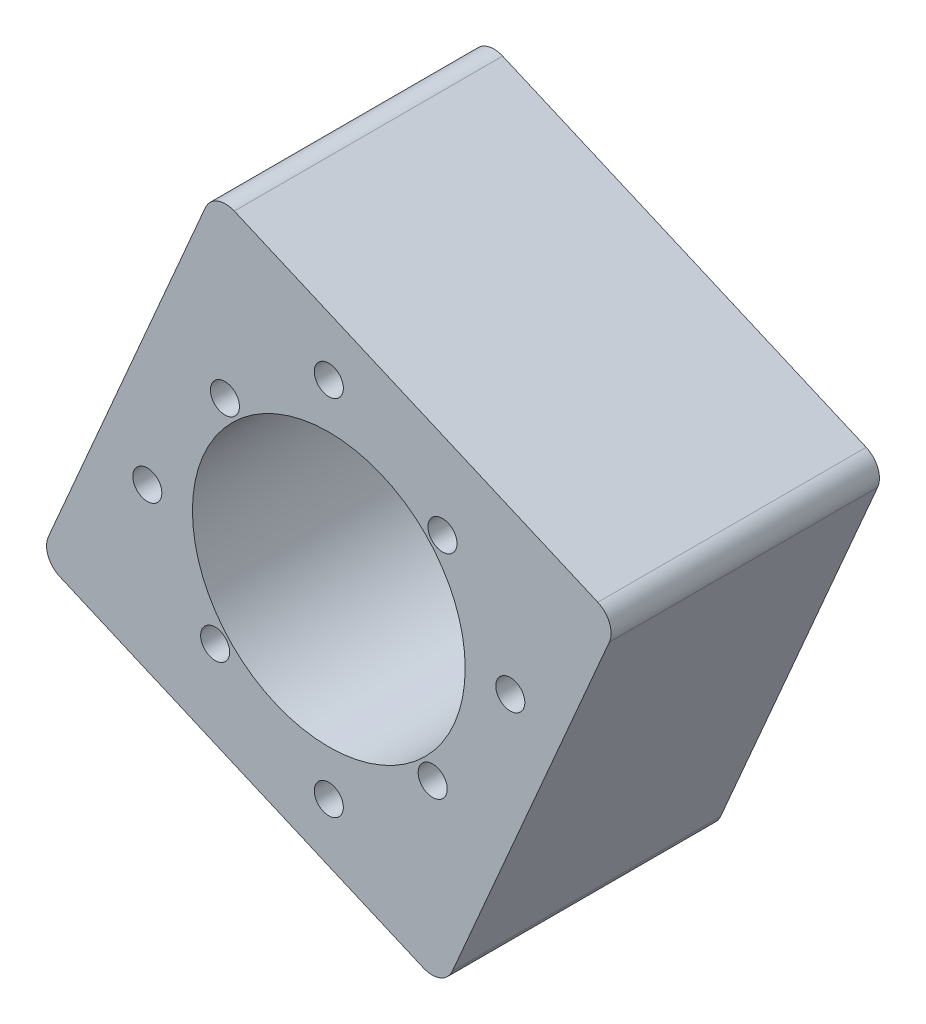
ISO-10303-21;
HEADER;
FILE_DESCRIPTION(('STEP AP214'),'2;1');
FILE_NAME('part.step','',(''),(''),'','','');
FILE_SCHEMA(('AUTOMOTIVE_DESIGN { 1 0 10303 214 1 1 1 1 }'));
ENDSEC;
DATA;
#1=APPLICATION_CONTEXT('core data for automotive mechanical design processes');
#2=APPLICATION_PROTOCOL_DEFINITION('international standard','automotive_design',2000,#1);
#3=PRODUCT_CONTEXT('',#1,'mechanical');
#4=PRODUCT('Part','Part','',(#3));
#5=PRODUCT_RELATED_PRODUCT_CATEGORY('part','',(#4));
#6=PRODUCT_DEFINITION_FORMATION('','',#4);
#7=PRODUCT_DEFINITION_CONTEXT('part definition',#1,'design');
#8=PRODUCT_DEFINITION('design','',#6,#7);
#9=PRODUCT_DEFINITION_SHAPE('','',#8);
#10=(LENGTH_UNIT() NAMED_UNIT(*) SI_UNIT(.MILLI.,.METRE.));
#11=(NAMED_UNIT(*) PLANE_ANGLE_UNIT() SI_UNIT($,.RADIAN.));
#12=(NAMED_UNIT(*) SI_UNIT($,.STERADIAN.) SOLID_ANGLE_UNIT());
#13=UNCERTAINTY_MEASURE_WITH_UNIT(LENGTH_MEASURE(1.E-05),#10,'distance_accuracy_value','');
#14=(GEOMETRIC_REPRESENTATION_CONTEXT(3) GLOBAL_UNCERTAINTY_ASSIGNED_CONTEXT((#13)) GLOBAL_UNIT_ASSIGNED_CONTEXT((#10,
#11,#12)) REPRESENTATION_CONTEXT('',''));
#15=CARTESIAN_POINT('',(0.,0.,0.));
#16=DIRECTION('',(0.,0.,1.));
#17=DIRECTION('',(1.,0.,0.));
#18=AXIS2_PLACEMENT_3D('',#15,#16,#17);
#19=CARTESIAN_POINT('',(0.,0.,7.));
#20=DIRECTION('',(0.,0.,-1.));
#21=DIRECTION('',(-1.,0.,0.));
#22=AXIS2_PLACEMENT_3D('',#19,#20,#21);
#23=CYLINDRICAL_SURFACE('',#22,25.);
#24=CARTESIAN_POINT('',(0.,0.,7.));
#25=DIRECTION('',(0.,0.,-1.));
#26=DIRECTION('',(-1.,0.,0.));
#27=AXIS2_PLACEMENT_3D('',#24,#25,#26);
#28=CIRCLE('',#27,25.);
#29=CARTESIAN_POINT('',(-25.,0.,7.));
#30=VERTEX_POINT('',#29);
#31=EDGE_CURVE('E161',#30,#30,#28,.T.);
#32=ORIENTED_EDGE('',*,*,#31,.F.);
#33=EDGE_LOOP('',(#32));
#34=FACE_BOUND('',#33,.T.);
#35=CARTESIAN_POINT('',(0.,0.,3.));
#36=DIRECTION('',(0.,0.,-1.));
#37=DIRECTION('',(-1.,0.,0.));
#38=AXIS2_PLACEMENT_3D('',#35,#36,#37);
#39=CIRCLE('',#38,25.);
#40=CARTESIAN_POINT('',(-25.,0.,3.));
#41=VERTEX_POINT('',#40);
#42=EDGE_CURVE('E67',#41,#41,#39,.F.);
#43=ORIENTED_EDGE('',*,*,#42,.F.);
#44=EDGE_LOOP('',(#43));
#45=FACE_BOUND('',#44,.T.);
#46=ADVANCED_FACE('F63',(#34,#45),#23,.F.);
#47=CARTESIAN_POINT('',(0.,0.,72.));
#48=DIRECTION('',(0.,0.,-1.));
#49=DIRECTION('',(-1.,0.,0.));
#50=AXIS2_PLACEMENT_3D('',#47,#48,#49);
#51=CYLINDRICAL_SURFACE('',#50,31.);
#52=CARTESIAN_POINT('',(0.,0.,61.));
#53=DIRECTION('',(0.,0.,1.));
#54=DIRECTION('',(1.,0.,0.));
#55=AXIS2_PLACEMENT_3D('',#52,#53,#54);
#56=CIRCLE('',#55,31.);
#57=CARTESIAN_POINT('',(31.,0.,61.));
#58=VERTEX_POINT('',#57);
#59=EDGE_CURVE('E72',#58,#58,#56,.T.);
#60=ORIENTED_EDGE('',*,*,#59,.T.);
#61=EDGE_LOOP('',(#60));
#62=FACE_BOUND('',#61,.T.);
#63=CARTESIAN_POINT('',(0.,0.,7.00000000000001));
#64=DIRECTION('',(0.,0.,-1.));
#65=DIRECTION('',(-1.,0.,0.));
#66=AXIS2_PLACEMENT_3D('',#63,#64,#65);
#67=CIRCLE('',#66,31.);
#68=CARTESIAN_POINT('',(-31.,0.,7.00000000000001));
#69=VERTEX_POINT('',#68);
#70=EDGE_CURVE('E13',#69,#69,#67,.F.);
#71=ORIENTED_EDGE('',*,*,#70,.F.);
#72=EDGE_LOOP('',(#71));
#73=FACE_BOUND('',#72,.T.);
#74=ADVANCED_FACE('F283',(#62,#73),#51,.F.);
#75=CARTESIAN_POINT('',(0.,0.,61.));
#76=DIRECTION('',(0.,0.,1.));
#77=DIRECTION('',(1.,0.,0.));
#78=AXIS2_PLACEMENT_3D('',#75,#76,#77);
#79=PLANE('',#78);
#80=CARTESIAN_POINT('',(-23.6085930044774,25.8386210225883,61.));
#81=DIRECTION('',(0.,0.,1.));
#82=DIRECTION('',(1.,0.,0.));
#83=AXIS2_PLACEMENT_3D('',#80,#81,#82);
#84=CIRCLE('',#83,3.29999999999999);
#85=CARTESIAN_POINT('',(-20.3085930044774,25.8386210225883,61.));
#86=VERTEX_POINT('',#85);
#87=EDGE_CURVE('E199',#86,#86,#84,.T.);
#88=ORIENTED_EDGE('',*,*,#87,.F.);
#89=EDGE_LOOP('',(#88));
#90=FACE_BOUND('',#89,.T.);
#91=CARTESIAN_POINT('',(-25.8386210225883,-23.6085930044774,61.));
#92=DIRECTION('',(0.,0.,1.));
#93=DIRECTION('',(1.,0.,0.));
#94=AXIS2_PLACEMENT_3D('',#91,#92,#93);
#95=CIRCLE('',#94,3.29999999999999);
#96=CARTESIAN_POINT('',(-22.5386210225883,-23.6085930044774,61.));
#97=VERTEX_POINT('',#96);
#98=EDGE_CURVE('E214',#97,#97,#95,.T.);
#99=ORIENTED_EDGE('',*,*,#98,.F.);
#100=EDGE_LOOP('',(#99));
#101=FACE_BOUND('',#100,.T.);
#102=CARTESIAN_POINT('',(23.6085930044774,-25.8386210225883,61.));
#103=DIRECTION('',(0.,0.,1.));
#104=DIRECTION('',(1.,0.,0.));
#105=AXIS2_PLACEMENT_3D('',#102,#103,#104);
#106=CIRCLE('',#105,3.29999999999999);
#107=CARTESIAN_POINT('',(26.9085930044774,-25.8386210225883,61.));
#108=VERTEX_POINT('',#107);
#109=EDGE_CURVE('E220',#108,#108,#106,.T.);
#110=ORIENTED_EDGE('',*,*,#109,.F.);
#111=EDGE_LOOP('',(#110));
#112=FACE_BOUND('',#111,.T.);
#113=CARTESIAN_POINT('',(25.8386210225883,23.6085930044774,61.));
#114=DIRECTION('',(0.,0.,1.));
#115=DIRECTION('',(1.,0.,0.));
#116=AXIS2_PLACEMENT_3D('',#113,#114,#115);
#117=CIRCLE('',#116,3.29999999999999);
#118=CARTESIAN_POINT('',(29.1386210225883,23.6085930044774,61.));
#119=VERTEX_POINT('',#118);
#120=EDGE_CURVE('E226',#119,#119,#117,.T.);
#121=ORIENTED_EDGE('',*,*,#120,.F.);
#122=EDGE_LOOP('',(#121));
#123=FACE_BOUND('',#122,.T.);
#124=CARTESIAN_POINT('',(-41.25,0.,61.));
#125=DIRECTION('',(0.,0.,-1.));
#126=DIRECTION('',(-1.,0.,0.));
#127=AXIS2_PLACEMENT_3D('',#124,#125,#126);
#128=CIRCLE('',#127,3.29999999999998);
#129=CARTESIAN_POINT('',(-44.55,0.,61.));
#130=VERTEX_POINT('',#129);
#131=EDGE_CURVE('E241',#130,#130,#128,.T.);
#132=ORIENTED_EDGE('',*,*,#131,.T.);
#133=EDGE_LOOP('',(#132));
#134=FACE_BOUND('',#133,.T.);
#135=CARTESIAN_POINT('',(0.,41.25,61.));
#136=DIRECTION('',(0.,0.,-1.));
#137=DIRECTION('',(-1.,0.,0.));
#138=AXIS2_PLACEMENT_3D('',#135,#136,#137);
#139=CIRCLE('',#138,3.29999999999998);
#140=CARTESIAN_POINT('',(-3.29999999999998,41.25,61.));
#141=VERTEX_POINT('',#140);
#142=EDGE_CURVE('E253',#141,#141,#139,.T.);
#143=ORIENTED_EDGE('',*,*,#142,.T.);
#144=EDGE_LOOP('',(#143));
#145=FACE_BOUND('',#144,.T.);
#146=CARTESIAN_POINT('',(41.25,0.,61.));
#147=DIRECTION('',(0.,0.,-1.));
#148=DIRECTION('',(-1.,0.,0.));
#149=AXIS2_PLACEMENT_3D('',#146,#147,#148);
#150=CIRCLE('',#149,3.29999999999998);
#151=CARTESIAN_POINT('',(37.95,0.,61.));
#152=VERTEX_POINT('',#151);
#153=EDGE_CURVE('E265',#152,#152,#150,.T.);
#154=ORIENTED_EDGE('',*,*,#153,.T.);
#155=EDGE_LOOP('',(#154));
#156=FACE_BOUND('',#155,.T.);
#157=CARTESIAN_POINT('',(0.,-41.25,61.));
#158=DIRECTION('',(0.,0.,-1.));
#159=DIRECTION('',(-1.,0.,0.));
#160=AXIS2_PLACEMENT_3D('',#157,#158,#159);
#161=CIRCLE('',#160,3.29999999999998);
#162=CARTESIAN_POINT('',(-3.29999999999998,-41.25,61.));
#163=VERTEX_POINT('',#162);
#164=EDGE_CURVE('E277',#163,#163,#161,.T.);
#165=ORIENTED_EDGE('',*,*,#164,.T.);
#166=EDGE_LOOP('',(#165));
#167=FACE_BOUND('',#166,.T.);
#168=ORIENTED_EDGE('',*,*,#59,.F.);
#169=EDGE_LOOP('',(#168));
#170=FACE_BOUND('',#169,.T.);
#171=DIRECTION('',(0.918019699144819,-0.396534780293048,0.));
#172=VECTOR('',#171,1.);
#173=CARTESIAN_POINT('',(19.8267390146524,45.900984957241,61.));
#174=LINE('',#173,#172);
#175=CARTESIAN_POINT('',(-21.4841474468645,63.7450500704281,61.));
#176=VERTEX_POINT('',#175);
#177=CARTESIAN_POINT('',(61.1376254761692,28.0569198440538,61.));
#178=VERTEX_POINT('',#177);
#179=EDGE_CURVE('E202',#176,#178,#174,.T.);
#180=ORIENTED_EDGE('',*,*,#179,.F.);
#181=CARTESIAN_POINT('',(-23.4668213483297,59.154951574704,61.));
#182=DIRECTION('',(0.,0.,1.));
#183=DIRECTION('',(1.,0.,0.));
#184=AXIS2_PLACEMENT_3D('',#181,#182,#183);
#185=CIRCLE('',#184,5.);
#186=CARTESIAN_POINT('',(-28.0569198440538,61.1376254761692,61.));
#187=VERTEX_POINT('',#186);
#188=EDGE_CURVE('E173',#176,#187,#185,.T.);
#189=ORIENTED_EDGE('',*,*,#188,.T.);
#190=DIRECTION('',(-0.396534780293047,-0.918019699144819,0.));
#191=VECTOR('',#190,1.);
#192=CARTESIAN_POINT('',(-45.900984957241,19.8267390146524,61.));
#193=LINE('',#192,#191);
#194=CARTESIAN_POINT('',(-63.7450500704281,-21.4841474468645,61.));
#195=VERTEX_POINT('',#194);
#196=EDGE_CURVE('E183',#187,#195,#193,.T.);
#197=ORIENTED_EDGE('',*,*,#196,.T.);
#198=CARTESIAN_POINT('',(-59.154951574704,-23.4668213483297,61.));
#199=DIRECTION('',(0.,0.,1.));
#200=DIRECTION('',(1.,0.,0.));
#201=AXIS2_PLACEMENT_3D('',#198,#199,#200);
#202=CIRCLE('',#201,5.);
#203=CARTESIAN_POINT('',(-61.1376254761692,-28.0569198440538,61.));
#204=VERTEX_POINT('',#203);
#205=EDGE_CURVE('E142',#204,#195,#202,.F.);
#206=ORIENTED_EDGE('',*,*,#205,.F.);
#207=DIRECTION('',(0.918019699144819,-0.396534780293047,0.));
#208=VECTOR('',#207,1.);
#209=CARTESIAN_POINT('',(-19.8267390146524,-45.900984957241,61.));
#210=LINE('',#209,#208);
#211=CARTESIAN_POINT('',(21.4841474468645,-63.7450500704281,61.));
#212=VERTEX_POINT('',#211);
#213=EDGE_CURVE('E135',#204,#212,#210,.T.);
#214=ORIENTED_EDGE('',*,*,#213,.T.);
#215=CARTESIAN_POINT('',(23.4668213483298,-59.154951574704,61.));
#216=DIRECTION('',(0.,0.,1.));
#217=DIRECTION('',(1.,0.,0.));
#218=AXIS2_PLACEMENT_3D('',#215,#216,#217);
#219=CIRCLE('',#218,5.);
#220=CARTESIAN_POINT('',(28.0569198440539,-61.1376254761692,61.));
#221=VERTEX_POINT('',#220);
#222=EDGE_CURVE('E139',#221,#212,#219,.F.);
#223=ORIENTED_EDGE('',*,*,#222,.F.);
#224=DIRECTION('',(-0.396534780293047,-0.918019699144819,0.));
#225=VECTOR('',#224,1.);
#226=CARTESIAN_POINT('',(45.900984957241,-19.8267390146524,61.));
#227=LINE('',#226,#225);
#228=CARTESIAN_POINT('',(63.7450500704281,21.4841474468645,61.));
#229=VERTEX_POINT('',#228);
#230=EDGE_CURVE('E193',#229,#221,#227,.T.);
#231=ORIENTED_EDGE('',*,*,#230,.F.);
#232=CARTESIAN_POINT('',(59.154951574704,23.4668213483297,61.));
#233=DIRECTION('',(0.,0.,1.));
#234=DIRECTION('',(1.,0.,0.));
#235=AXIS2_PLACEMENT_3D('',#232,#233,#234);
#236=CIRCLE('',#235,5.);
#237=EDGE_CURVE('E188',#229,#178,#236,.T.);
#238=ORIENTED_EDGE('',*,*,#237,.T.);
#239=EDGE_LOOP('',(#180,#189,#197,#206,#214,#223,#231,#238));
#240=FACE_BOUND('',#239,.T.);
#241=ADVANCED_FACE('F137',(#90,#101,#112,#123,#134,#145,#156,#167,#170,#240),#79,.T.);
#242=CARTESIAN_POINT('',(0.,0.,0.));
#243=DIRECTION('',(0.,0.,1.));
#244=DIRECTION('',(1.,0.,0.));
#245=AXIS2_PLACEMENT_3D('',#242,#243,#244);
#246=PLANE('',#245);
#247=CARTESIAN_POINT('',(0.,0.,0.));
#248=DIRECTION('',(0.,0.,-1.));
#249=DIRECTION('',(-1.,0.,0.));
#250=AXIS2_PLACEMENT_3D('',#247,#248,#249);
#251=CIRCLE('',#250,31.);
#252=CARTESIAN_POINT('',(-31.,0.,0.));
#253=VERTEX_POINT('',#252);
#254=EDGE_CURVE('E695',#253,#253,#251,.T.);
#255=ORIENTED_EDGE('',*,*,#254,.F.);
#256=EDGE_LOOP('',(#255));
#257=FACE_BOUND('',#256,.T.);
#258=CARTESIAN_POINT('',(-41.25,0.,0.));
#259=DIRECTION('',(0.,0.,-1.));
#260=DIRECTION('',(-1.,0.,0.));
#261=AXIS2_PLACEMENT_3D('',#258,#259,#260);
#262=CIRCLE('',#261,6.5);
#263=CARTESIAN_POINT('',(-47.75,0.,0.));
#264=VERTEX_POINT('',#263);
#265=EDGE_CURVE('E232',#264,#264,#262,.T.);
#266=ORIENTED_EDGE('',*,*,#265,.F.);
#267=EDGE_LOOP('',(#266));
#268=FACE_BOUND('',#267,.T.);
#269=CARTESIAN_POINT('',(0.,41.25,0.));
#270=DIRECTION('',(0.,0.,-1.));
#271=DIRECTION('',(-1.,0.,0.));
#272=AXIS2_PLACEMENT_3D('',#269,#270,#271);
#273=CIRCLE('',#272,6.5);
#274=CARTESIAN_POINT('',(-6.5,41.25,0.));
#275=VERTEX_POINT('',#274);
#276=EDGE_CURVE('E244',#275,#275,#273,.T.);
#277=ORIENTED_EDGE('',*,*,#276,.F.);
#278=EDGE_LOOP('',(#277));
#279=FACE_BOUND('',#278,.T.);
#280=CARTESIAN_POINT('',(41.25,0.,0.));
#281=DIRECTION('',(0.,0.,-1.));
#282=DIRECTION('',(-1.,0.,0.));
#283=AXIS2_PLACEMENT_3D('',#280,#281,#282);
#284=CIRCLE('',#283,6.5);
#285=CARTESIAN_POINT('',(34.75,0.,0.));
#286=VERTEX_POINT('',#285);
#287=EDGE_CURVE('E256',#286,#286,#284,.T.);
#288=ORIENTED_EDGE('',*,*,#287,.F.);
#289=EDGE_LOOP('',(#288));
#290=FACE_BOUND('',#289,.T.);
#291=CARTESIAN_POINT('',(0.,-41.25,0.));
#292=DIRECTION('',(0.,0.,-1.));
#293=DIRECTION('',(-1.,0.,0.));
#294=AXIS2_PLACEMENT_3D('',#291,#292,#293);
#295=CIRCLE('',#294,6.5);
#296=CARTESIAN_POINT('',(-6.5,-41.25,0.));
#297=VERTEX_POINT('',#296);
#298=EDGE_CURVE('E268',#297,#297,#295,.T.);
#299=ORIENTED_EDGE('',*,*,#298,.F.);
#300=EDGE_LOOP('',(#299));
#301=FACE_BOUND('',#300,.T.);
#302=DIRECTION('',(-0.396534780293047,-0.91801969914482,0.));
#303=VECTOR('',#302,1.);
#304=CARTESIAN_POINT('',(45.900984957241,-19.8267390146524,0.));
#305=LINE('',#304,#303);
#306=CARTESIAN_POINT('',(63.7450500704281,21.4841474468645,0.));
#307=VERTEX_POINT('',#306);
#308=CARTESIAN_POINT('',(28.0569198440539,-61.1376254761692,0.));
#309=VERTEX_POINT('',#308);
#310=EDGE_CURVE('E194',#307,#309,#305,.T.);
#311=ORIENTED_EDGE('',*,*,#310,.T.);
#312=CARTESIAN_POINT('',(23.4668213483298,-59.154951574704,0.));
#313=DIRECTION('',(0.,0.,-1.));
#314=DIRECTION('',(-1.,0.,0.));
#315=AXIS2_PLACEMENT_3D('',#312,#313,#314);
#316=CIRCLE('',#315,5.);
#317=CARTESIAN_POINT('',(21.4841474468645,-63.7450500704281,0.));
#318=VERTEX_POINT('',#317);
#319=EDGE_CURVE('E159',#309,#318,#316,.T.);
#320=ORIENTED_EDGE('',*,*,#319,.T.);
#321=DIRECTION('',(0.91801969914482,-0.396534780293047,0.));
#322=VECTOR('',#321,1.);
#323=CARTESIAN_POINT('',(-19.8267390146524,-45.900984957241,0.));
#324=LINE('',#323,#322);
#325=CARTESIAN_POINT('',(-61.1376254761692,-28.0569198440539,0.));
#326=VERTEX_POINT('',#325);
#327=EDGE_CURVE('E152',#326,#318,#324,.T.);
#328=ORIENTED_EDGE('',*,*,#327,.F.);
#329=CARTESIAN_POINT('',(-59.154951574704,-23.4668213483297,0.));
#330=DIRECTION('',(0.,0.,-1.));
#331=DIRECTION('',(-1.,0.,0.));
#332=AXIS2_PLACEMENT_3D('',#329,#330,#331);
#333=CIRCLE('',#332,5.);
#334=CARTESIAN_POINT('',(-63.7450500704281,-21.4841474468645,0.));
#335=VERTEX_POINT('',#334);
#336=EDGE_CURVE('E145',#326,#335,#333,.T.);
#337=ORIENTED_EDGE('',*,*,#336,.T.);
#338=DIRECTION('',(-0.396534780293047,-0.91801969914482,0.));
#339=VECTOR('',#338,1.);
#340=CARTESIAN_POINT('',(-45.900984957241,19.8267390146524,0.));
#341=LINE('',#340,#339);
#342=CARTESIAN_POINT('',(-28.0569198440538,61.1376254761692,0.));
#343=VERTEX_POINT('',#342);
#344=EDGE_CURVE('E180',#343,#335,#341,.T.);
#345=ORIENTED_EDGE('',*,*,#344,.F.);
#346=CARTESIAN_POINT('',(-23.4668213483297,59.154951574704,0.));
#347=DIRECTION('',(0.,0.,-1.));
#348=DIRECTION('',(-1.,0.,0.));
#349=AXIS2_PLACEMENT_3D('',#346,#347,#348);
#350=CIRCLE('',#349,5.);
#351=CARTESIAN_POINT('',(-21.4841474468645,63.7450500704281,0.));
#352=VERTEX_POINT('',#351);
#353=EDGE_CURVE('E179',#352,#343,#350,.F.);
#354=ORIENTED_EDGE('',*,*,#353,.F.);
#355=DIRECTION('',(0.91801969914482,-0.396534780293048,0.));
#356=VECTOR('',#355,1.);
#357=CARTESIAN_POINT('',(19.8267390146524,45.900984957241,0.));
#358=LINE('',#357,#356);
#359=CARTESIAN_POINT('',(61.1376254761692,28.0569198440538,0.));
#360=VERTEX_POINT('',#359);
#361=EDGE_CURVE('E190',#352,#360,#358,.T.);
#362=ORIENTED_EDGE('',*,*,#361,.T.);
#363=CARTESIAN_POINT('',(59.154951574704,23.4668213483297,0.));
#364=DIRECTION('',(0.,0.,-1.));
#365=DIRECTION('',(-1.,0.,0.));
#366=AXIS2_PLACEMENT_3D('',#363,#364,#365);
#367=CIRCLE('',#366,5.);
#368=EDGE_CURVE('E196',#307,#360,#367,.F.);
#369=ORIENTED_EDGE('',*,*,#368,.F.);
#370=EDGE_LOOP('',(#311,#320,#328,#337,#345,#354,#362,#369));
#371=FACE_BOUND('',#370,.T.);
#372=ADVANCED_FACE('F65',(#257,#268,#279,#290,#301,#371),#246,.F.);
#373=CARTESIAN_POINT('',(0.,-41.25,0.));
#374=DIRECTION('',(0.,0.,-1.));
#375=DIRECTION('',(-1.,0.,0.));
#376=AXIS2_PLACEMENT_3D('',#373,#374,#375);
#377=CYLINDRICAL_SURFACE('',#376,3.29999999999999);
#378=ORIENTED_EDGE('',*,*,#164,.F.);
#379=EDGE_LOOP('',(#378));
#380=FACE_BOUND('',#379,.T.);
#381=CARTESIAN_POINT('',(0.,-41.25,4.6));
#382=DIRECTION('',(0.,0.,-1.));
#383=DIRECTION('',(-1.,0.,0.));
#384=AXIS2_PLACEMENT_3D('',#381,#382,#383);
#385=CIRCLE('',#384,3.3);
#386=CARTESIAN_POINT('',(-3.3,-41.25,4.6));
#387=VERTEX_POINT('',#386);
#388=EDGE_CURVE('E274',#387,#387,#385,.T.);
#389=ORIENTED_EDGE('',*,*,#388,.T.);
#390=EDGE_LOOP('',(#389));
#391=FACE_BOUND('',#390,.T.);
#392=ADVANCED_FACE('F292',(#380,#391),#377,.F.);
#393=CARTESIAN_POINT('',(3.3,-41.25,4.6));
#394=DIRECTION('',(0.,0.,1.));
#395=DIRECTION('',(1.,0.,0.));
#396=AXIS2_PLACEMENT_3D('',#393,#394,#395);
#397=PLANE('',#396);
#398=ORIENTED_EDGE('',*,*,#388,.F.);
#399=EDGE_LOOP('',(#398));
#400=FACE_BOUND('',#399,.T.);
#401=CARTESIAN_POINT('',(0.,-41.25,4.6));
#402=DIRECTION('',(0.,0.,-1.));
#403=DIRECTION('',(-1.,0.,0.));
#404=AXIS2_PLACEMENT_3D('',#401,#402,#403);
#405=CIRCLE('',#404,6.5);
#406=CARTESIAN_POINT('',(-6.5,-41.25,4.6));
#407=VERTEX_POINT('',#406);
#408=EDGE_CURVE('E271',#407,#407,#405,.T.);
#409=ORIENTED_EDGE('',*,*,#408,.T.);
#410=EDGE_LOOP('',(#409));
#411=FACE_BOUND('',#410,.T.);
#412=ADVANCED_FACE('F410',(#400,#411),#397,.F.);
#413=CARTESIAN_POINT('',(0.,-41.25,0.));
#414=DIRECTION('',(0.,0.,-1.));
#415=DIRECTION('',(-1.,0.,0.));
#416=AXIS2_PLACEMENT_3D('',#413,#414,#415);
#417=CYLINDRICAL_SURFACE('',#416,6.5);
#418=ORIENTED_EDGE('',*,*,#408,.F.);
#419=EDGE_LOOP('',(#418));
#420=FACE_BOUND('',#419,.T.);
#421=ORIENTED_EDGE('',*,*,#298,.T.);
#422=EDGE_LOOP('',(#421));
#423=FACE_BOUND('',#422,.T.);
#424=ADVANCED_FACE('F406',(#420,#423),#417,.F.);
#425=CARTESIAN_POINT('',(41.25,0.,0.));
#426=DIRECTION('',(0.,0.,-1.));
#427=DIRECTION('',(-1.,0.,0.));
#428=AXIS2_PLACEMENT_3D('',#425,#426,#427);
#429=CYLINDRICAL_SURFACE('',#428,3.29999999999999);
#430=ORIENTED_EDGE('',*,*,#153,.F.);
#431=EDGE_LOOP('',(#430));
#432=FACE_BOUND('',#431,.T.);
#433=CARTESIAN_POINT('',(41.25,0.,4.6));
#434=DIRECTION('',(0.,0.,-1.));
#435=DIRECTION('',(-1.,0.,0.));
#436=AXIS2_PLACEMENT_3D('',#433,#434,#435);
#437=CIRCLE('',#436,3.3);
#438=CARTESIAN_POINT('',(37.95,0.,4.6));
#439=VERTEX_POINT('',#438);
#440=EDGE_CURVE('E262',#439,#439,#437,.T.);
#441=ORIENTED_EDGE('',*,*,#440,.T.);
#442=EDGE_LOOP('',(#441));
#443=FACE_BOUND('',#442,.T.);
#444=ADVANCED_FACE('F402',(#432,#443),#429,.F.);
#445=CARTESIAN_POINT('',(44.55,0.,4.6));
#446=DIRECTION('',(0.,0.,1.));
#447=DIRECTION('',(1.,0.,0.));
#448=AXIS2_PLACEMENT_3D('',#445,#446,#447);
#449=PLANE('',#448);
#450=ORIENTED_EDGE('',*,*,#440,.F.);
#451=EDGE_LOOP('',(#450));
#452=FACE_BOUND('',#451,.T.);
#453=CARTESIAN_POINT('',(41.25,0.,4.6));
#454=DIRECTION('',(0.,0.,-1.));
#455=DIRECTION('',(-1.,0.,0.));
#456=AXIS2_PLACEMENT_3D('',#453,#454,#455);
#457=CIRCLE('',#456,6.5);
#458=CARTESIAN_POINT('',(34.75,0.,4.6));
#459=VERTEX_POINT('',#458);
#460=EDGE_CURVE('E259',#459,#459,#457,.T.);
#461=ORIENTED_EDGE('',*,*,#460,.T.);
#462=EDGE_LOOP('',(#461));
#463=FACE_BOUND('',#462,.T.);
#464=ADVANCED_FACE('F398',(#452,#463),#449,.F.);
#465=CARTESIAN_POINT('',(41.25,0.,0.));
#466=DIRECTION('',(0.,0.,-1.));
#467=DIRECTION('',(-1.,0.,0.));
#468=AXIS2_PLACEMENT_3D('',#465,#466,#467);
#469=CYLINDRICAL_SURFACE('',#468,6.5);
#470=ORIENTED_EDGE('',*,*,#460,.F.);
#471=EDGE_LOOP('',(#470));
#472=FACE_BOUND('',#471,.T.);
#473=ORIENTED_EDGE('',*,*,#287,.T.);
#474=EDGE_LOOP('',(#473));
#475=FACE_BOUND('',#474,.T.);
#476=ADVANCED_FACE('F394',(#472,#475),#469,.F.);
#477=CARTESIAN_POINT('',(0.,41.25,0.));
#478=DIRECTION('',(0.,0.,-1.));
#479=DIRECTION('',(-1.,0.,0.));
#480=AXIS2_PLACEMENT_3D('',#477,#478,#479);
#481=CYLINDRICAL_SURFACE('',#480,3.29999999999999);
#482=ORIENTED_EDGE('',*,*,#142,.F.);
#483=EDGE_LOOP('',(#482));
#484=FACE_BOUND('',#483,.T.);
#485=CARTESIAN_POINT('',(0.,41.25,4.6));
#486=DIRECTION('',(0.,0.,-1.));
#487=DIRECTION('',(-1.,0.,0.));
#488=AXIS2_PLACEMENT_3D('',#485,#486,#487);
#489=CIRCLE('',#488,3.3);
#490=CARTESIAN_POINT('',(-3.3,41.25,4.6));
#491=VERTEX_POINT('',#490);
#492=EDGE_CURVE('E250',#491,#491,#489,.T.);
#493=ORIENTED_EDGE('',*,*,#492,.T.);
#494=EDGE_LOOP('',(#493));
#495=FACE_BOUND('',#494,.T.);
#496=ADVANCED_FACE('F390',(#484,#495),#481,.F.);
#497=CARTESIAN_POINT('',(3.3,41.25,4.6));
#498=DIRECTION('',(0.,0.,1.));
#499=DIRECTION('',(1.,0.,0.));
#500=AXIS2_PLACEMENT_3D('',#497,#498,#499);
#501=PLANE('',#500);
#502=ORIENTED_EDGE('',*,*,#492,.F.);
#503=EDGE_LOOP('',(#502));
#504=FACE_BOUND('',#503,.T.);
#505=CARTESIAN_POINT('',(0.,41.25,4.6));
#506=DIRECTION('',(0.,0.,-1.));
#507=DIRECTION('',(-1.,0.,0.));
#508=AXIS2_PLACEMENT_3D('',#505,#506,#507);
#509=CIRCLE('',#508,6.5);
#510=CARTESIAN_POINT('',(-6.5,41.25,4.6));
#511=VERTEX_POINT('',#510);
#512=EDGE_CURVE('E247',#511,#511,#509,.T.);
#513=ORIENTED_EDGE('',*,*,#512,.T.);
#514=EDGE_LOOP('',(#513));
#515=FACE_BOUND('',#514,.T.);
#516=ADVANCED_FACE('F386',(#504,#515),#501,.F.);
#517=CARTESIAN_POINT('',(0.,41.25,0.));
#518=DIRECTION('',(0.,0.,-1.));
#519=DIRECTION('',(-1.,0.,0.));
#520=AXIS2_PLACEMENT_3D('',#517,#518,#519);
#521=CYLINDRICAL_SURFACE('',#520,6.5);
#522=ORIENTED_EDGE('',*,*,#512,.F.);
#523=EDGE_LOOP('',(#522));
#524=FACE_BOUND('',#523,.T.);
#525=ORIENTED_EDGE('',*,*,#276,.T.);
#526=EDGE_LOOP('',(#525));
#527=FACE_BOUND('',#526,.T.);
#528=ADVANCED_FACE('F382',(#524,#527),#521,.F.);
#529=CARTESIAN_POINT('',(-41.25,0.,0.));
#530=DIRECTION('',(0.,0.,-1.));
#531=DIRECTION('',(-1.,0.,0.));
#532=AXIS2_PLACEMENT_3D('',#529,#530,#531);
#533=CYLINDRICAL_SURFACE('',#532,3.29999999999999);
#534=ORIENTED_EDGE('',*,*,#131,.F.);
#535=EDGE_LOOP('',(#534));
#536=FACE_BOUND('',#535,.T.);
#537=CARTESIAN_POINT('',(-41.25,0.,4.6));
#538=DIRECTION('',(0.,0.,-1.));
#539=DIRECTION('',(-1.,0.,0.));
#540=AXIS2_PLACEMENT_3D('',#537,#538,#539);
#541=CIRCLE('',#540,3.3);
#542=CARTESIAN_POINT('',(-44.55,0.,4.6));
#543=VERTEX_POINT('',#542);
#544=EDGE_CURVE('E238',#543,#543,#541,.T.);
#545=ORIENTED_EDGE('',*,*,#544,.T.);
#546=EDGE_LOOP('',(#545));
#547=FACE_BOUND('',#546,.T.);
#548=ADVANCED_FACE('F378',(#536,#547),#533,.F.);
#549=CARTESIAN_POINT('',(-37.95,0.,4.6));
#550=DIRECTION('',(0.,0.,1.));
#551=DIRECTION('',(1.,0.,0.));
#552=AXIS2_PLACEMENT_3D('',#549,#550,#551);
#553=PLANE('',#552);
#554=ORIENTED_EDGE('',*,*,#544,.F.);
#555=EDGE_LOOP('',(#554));
#556=FACE_BOUND('',#555,.T.);
#557=CARTESIAN_POINT('',(-41.25,0.,4.6));
#558=DIRECTION('',(0.,0.,-1.));
#559=DIRECTION('',(-1.,0.,0.));
#560=AXIS2_PLACEMENT_3D('',#557,#558,#559);
#561=CIRCLE('',#560,6.5);
#562=CARTESIAN_POINT('',(-47.75,0.,4.6));
#563=VERTEX_POINT('',#562);
#564=EDGE_CURVE('E235',#563,#563,#561,.T.);
#565=ORIENTED_EDGE('',*,*,#564,.T.);
#566=EDGE_LOOP('',(#565));
#567=FACE_BOUND('',#566,.T.);
#568=ADVANCED_FACE('F374',(#556,#567),#553,.F.);
#569=CARTESIAN_POINT('',(-41.25,0.,0.));
#570=DIRECTION('',(0.,0.,-1.));
#571=DIRECTION('',(-1.,0.,0.));
#572=AXIS2_PLACEMENT_3D('',#569,#570,#571);
#573=CYLINDRICAL_SURFACE('',#572,6.5);
#574=ORIENTED_EDGE('',*,*,#564,.F.);
#575=EDGE_LOOP('',(#574));
#576=FACE_BOUND('',#575,.T.);
#577=ORIENTED_EDGE('',*,*,#265,.T.);
#578=EDGE_LOOP('',(#577));
#579=FACE_BOUND('',#578,.T.);
#580=ADVANCED_FACE('F371',(#576,#579),#573,.F.);
#581=CARTESIAN_POINT('',(25.8386210225883,23.6085930044774,56.));
#582=DIRECTION('',(0.,0.,1.));
#583=DIRECTION('',(1.,0.,0.));
#584=AXIS2_PLACEMENT_3D('',#581,#582,#583);
#585=CONICAL_SURFACE('',#584,3.29999999999999,1.0471975511966);
#586=CARTESIAN_POINT('',(25.8386210225883,23.6085930044774,54.0947441116742));
#587=VERTEX_POINT('',#586);
#588=VERTEX_LOOP('',#587);
#589=FACE_BOUND('',#588,.T.);
#590=CARTESIAN_POINT('',(25.8386210225883,23.6085930044774,56.));
#591=DIRECTION('',(0.,0.,1.));
#592=DIRECTION('',(1.,0.,0.));
#593=AXIS2_PLACEMENT_3D('',#590,#591,#592);
#594=CIRCLE('',#593,3.29999999999999);
#595=CARTESIAN_POINT('',(29.1386210225883,23.6085930044774,56.));
#596=VERTEX_POINT('',#595);
#597=EDGE_CURVE('E229',#596,#596,#594,.T.);
#598=ORIENTED_EDGE('',*,*,#597,.T.);
#599=EDGE_LOOP('',(#598));
#600=FACE_BOUND('',#599,.T.);
#601=ADVANCED_FACE('F367',(#589,#600),#585,.F.);
#602=CARTESIAN_POINT('',(25.8386210225883,23.6085930044774,61.));
#603=DIRECTION('',(0.,0.,1.));
#604=DIRECTION('',(1.,0.,0.));
#605=AXIS2_PLACEMENT_3D('',#602,#603,#604);
#606=CYLINDRICAL_SURFACE('',#605,3.29999999999999);
#607=ORIENTED_EDGE('',*,*,#597,.F.);
#608=EDGE_LOOP('',(#607));
#609=FACE_BOUND('',#608,.T.);
#610=ORIENTED_EDGE('',*,*,#120,.T.);
#611=EDGE_LOOP('',(#610));
#612=FACE_BOUND('',#611,.T.);
#613=ADVANCED_FACE('F364',(#609,#612),#606,.F.);
#614=CARTESIAN_POINT('',(23.6085930044774,-25.8386210225883,56.));
#615=DIRECTION('',(0.,0.,1.));
#616=DIRECTION('',(1.,0.,0.));
#617=AXIS2_PLACEMENT_3D('',#614,#615,#616);
#618=CONICAL_SURFACE('',#617,3.29999999999999,1.0471975511966);
#619=CARTESIAN_POINT('',(23.6085930044774,-25.8386210225883,54.0947441116742));
#620=VERTEX_POINT('',#619);
#621=VERTEX_LOOP('',#620);
#622=FACE_BOUND('',#621,.T.);
#623=CARTESIAN_POINT('',(23.6085930044774,-25.8386210225883,56.));
#624=DIRECTION('',(0.,0.,1.));
#625=DIRECTION('',(1.,0.,0.));
#626=AXIS2_PLACEMENT_3D('',#623,#624,#625);
#627=CIRCLE('',#626,3.29999999999999);
#628=CARTESIAN_POINT('',(26.9085930044774,-25.8386210225883,56.));
#629=VERTEX_POINT('',#628);
#630=EDGE_CURVE('E223',#629,#629,#627,.T.);
#631=ORIENTED_EDGE('',*,*,#630,.T.);
#632=EDGE_LOOP('',(#631));
#633=FACE_BOUND('',#632,.T.);
#634=ADVANCED_FACE('F360',(#622,#633),#618,.F.);
#635=CARTESIAN_POINT('',(23.6085930044774,-25.8386210225883,61.));
#636=DIRECTION('',(0.,0.,1.));
#637=DIRECTION('',(1.,0.,0.));
#638=AXIS2_PLACEMENT_3D('',#635,#636,#637);
#639=CYLINDRICAL_SURFACE('',#638,3.29999999999999);
#640=ORIENTED_EDGE('',*,*,#630,.F.);
#641=EDGE_LOOP('',(#640));
#642=FACE_BOUND('',#641,.T.);
#643=ORIENTED_EDGE('',*,*,#109,.T.);
#644=EDGE_LOOP('',(#643));
#645=FACE_BOUND('',#644,.T.);
#646=ADVANCED_FACE('F356',(#642,#645),#639,.F.);
#647=CARTESIAN_POINT('',(-25.8386210225883,-23.6085930044774,56.));
#648=DIRECTION('',(0.,0.,1.));
#649=DIRECTION('',(1.,0.,0.));
#650=AXIS2_PLACEMENT_3D('',#647,#648,#649);
#651=CONICAL_SURFACE('',#650,3.29999999999999,1.0471975511966);
#652=CARTESIAN_POINT('',(-25.8386210225883,-23.6085930044774,54.0947441116742));
#653=VERTEX_POINT('',#652);
#654=VERTEX_LOOP('',#653);
#655=FACE_BOUND('',#654,.T.);
#656=CARTESIAN_POINT('',(-25.8386210225883,-23.6085930044774,56.));
#657=DIRECTION('',(0.,0.,1.));
#658=DIRECTION('',(1.,0.,0.));
#659=AXIS2_PLACEMENT_3D('',#656,#657,#658);
#660=CIRCLE('',#659,3.29999999999999);
#661=CARTESIAN_POINT('',(-22.5386210225883,-23.6085930044774,56.));
#662=VERTEX_POINT('',#661);
#663=EDGE_CURVE('E217',#662,#662,#660,.T.);
#664=ORIENTED_EDGE('',*,*,#663,.T.);
#665=EDGE_LOOP('',(#664));
#666=FACE_BOUND('',#665,.T.);
#667=ADVANCED_FACE('F352',(#655,#666),#651,.F.);
#668=CARTESIAN_POINT('',(-25.8386210225883,-23.6085930044774,61.));
#669=DIRECTION('',(0.,0.,1.));
#670=DIRECTION('',(1.,0.,0.));
#671=AXIS2_PLACEMENT_3D('',#668,#669,#670);
#672=CYLINDRICAL_SURFACE('',#671,3.29999999999999);
#673=ORIENTED_EDGE('',*,*,#663,.F.);
#674=EDGE_LOOP('',(#673));
#675=FACE_BOUND('',#674,.T.);
#676=ORIENTED_EDGE('',*,*,#98,.T.);
#677=EDGE_LOOP('',(#676));
#678=FACE_BOUND('',#677,.T.);
#679=ADVANCED_FACE('F348',(#675,#678),#672,.F.);
#680=CARTESIAN_POINT('',(-23.6085930044774,25.8386210225883,56.));
#681=DIRECTION('',(0.,0.,1.));
#682=DIRECTION('',(1.,0.,0.));
#683=AXIS2_PLACEMENT_3D('',#680,#681,#682);
#684=CONICAL_SURFACE('',#683,3.29999999999999,1.0471975511966);
#685=CARTESIAN_POINT('',(-23.6085930044774,25.8386210225883,54.0947441116742));
#686=VERTEX_POINT('',#685);
#687=VERTEX_LOOP('',#686);
#688=FACE_BOUND('',#687,.T.);
#689=CARTESIAN_POINT('',(-23.6085930044774,25.8386210225883,56.));
#690=DIRECTION('',(0.,0.,1.));
#691=DIRECTION('',(1.,0.,0.));
#692=AXIS2_PLACEMENT_3D('',#689,#690,#691);
#693=CIRCLE('',#692,3.29999999999999);
#694=CARTESIAN_POINT('',(-20.3085930044774,25.8386210225883,56.));
#695=VERTEX_POINT('',#694);
#696=EDGE_CURVE('E211',#695,#695,#693,.T.);
#697=ORIENTED_EDGE('',*,*,#696,.T.);
#698=EDGE_LOOP('',(#697));
#699=FACE_BOUND('',#698,.T.);
#700=ADVANCED_FACE('F344',(#688,#699),#684,.F.);
#701=CARTESIAN_POINT('',(-23.6085930044774,25.8386210225883,61.));
#702=DIRECTION('',(0.,0.,1.));
#703=DIRECTION('',(1.,0.,0.));
#704=AXIS2_PLACEMENT_3D('',#701,#702,#703);
#705=CYLINDRICAL_SURFACE('',#704,3.29999999999999);
#706=ORIENTED_EDGE('',*,*,#696,.F.);
#707=EDGE_LOOP('',(#706));
#708=FACE_BOUND('',#707,.T.);
#709=ORIENTED_EDGE('',*,*,#87,.T.);
#710=EDGE_LOOP('',(#709));
#711=FACE_BOUND('',#710,.T.);
#712=ADVANCED_FACE('F340',(#708,#711),#705,.F.);
#713=CARTESIAN_POINT('',(45.900984957241,-19.8267390146524,201.27877475904));
#714=DIRECTION('',(0.918019699144819,-0.396534780293047,0.));
#715=DIRECTION('',(0.396534780293047,0.918019699144819,0.));
#716=AXIS2_PLACEMENT_3D('',#713,#714,#715);
#717=PLANE('',#716);
#718=DIRECTION('',(0.,0.,-1.));
#719=VECTOR('',#718,1.);
#720=CARTESIAN_POINT('',(63.7450500704281,21.4841474468645,201.27877475904));
#721=LINE('',#720,#719);
#722=EDGE_CURVE('E200',#229,#307,#721,.T.);
#723=ORIENTED_EDGE('',*,*,#722,.F.);
#724=ORIENTED_EDGE('',*,*,#230,.T.);
#725=DIRECTION('',(0.,0.,-1.));
#726=VECTOR('',#725,1.);
#727=CARTESIAN_POINT('',(28.0569198440539,-61.1376254761692,201.27877475904));
#728=LINE('',#727,#726);
#729=EDGE_CURVE('E146',#221,#309,#728,.T.);
#730=ORIENTED_EDGE('',*,*,#729,.T.);
#731=ORIENTED_EDGE('',*,*,#310,.F.);
#732=EDGE_LOOP('',(#723,#724,#730,#731));
#733=FACE_BOUND('',#732,.T.);
#734=ADVANCED_FACE('F336',(#733),#717,.T.);
#735=CARTESIAN_POINT('',(19.8267390146524,45.900984957241,201.27877475904));
#736=DIRECTION('',(0.396534780293047,0.918019699144819,0.));
#737=DIRECTION('',(-0.918019699144819,0.396534780293048,0.));
#738=AXIS2_PLACEMENT_3D('',#735,#736,#737);
#739=PLANE('',#738);
#740=ORIENTED_EDGE('',*,*,#361,.F.);
#741=DIRECTION('',(0.,0.,-1.));
#742=VECTOR('',#741,1.);
#743=CARTESIAN_POINT('',(-21.4841474468645,63.7450500704281,201.27877475904));
#744=LINE('',#743,#742);
#745=EDGE_CURVE('E176',#176,#352,#744,.T.);
#746=ORIENTED_EDGE('',*,*,#745,.F.);
#747=ORIENTED_EDGE('',*,*,#179,.T.);
#748=DIRECTION('',(0.,0.,-1.));
#749=VECTOR('',#748,1.);
#750=CARTESIAN_POINT('',(61.1376254761692,28.0569198440538,201.27877475904));
#751=LINE('',#750,#749);
#752=EDGE_CURVE('E206',#178,#360,#751,.T.);
#753=ORIENTED_EDGE('',*,*,#752,.T.);
#754=EDGE_LOOP('',(#740,#746,#747,#753));
#755=FACE_BOUND('',#754,.T.);
#756=ADVANCED_FACE('F332',(#755),#739,.T.);
#757=CARTESIAN_POINT('',(59.154951574704,23.4668213483297,201.27877475904));
#758=DIRECTION('',(0.,0.,-1.));
#759=DIRECTION('',(-1.,0.,0.));
#760=AXIS2_PLACEMENT_3D('',#757,#758,#759);
#761=CYLINDRICAL_SURFACE('',#760,5.);
#762=ORIENTED_EDGE('',*,*,#237,.F.);
#763=ORIENTED_EDGE('',*,*,#722,.T.);
#764=ORIENTED_EDGE('',*,*,#368,.T.);
#765=ORIENTED_EDGE('',*,*,#752,.F.);
#766=EDGE_LOOP('',(#762,#763,#764,#765));
#767=FACE_BOUND('',#766,.T.);
#768=ADVANCED_FACE('F325',(#767),#761,.T.);
#769=CARTESIAN_POINT('',(-45.900984957241,19.8267390146524,201.27877475904));
#770=DIRECTION('',(0.918019699144819,-0.396534780293047,0.));
#771=DIRECTION('',(0.396534780293047,0.918019699144819,0.));
#772=AXIS2_PLACEMENT_3D('',#769,#770,#771);
#773=PLANE('',#772);
#774=ORIENTED_EDGE('',*,*,#196,.F.);
#775=DIRECTION('',(0.,0.,-1.));
#776=VECTOR('',#775,1.);
#777=CARTESIAN_POINT('',(-28.0569198440538,61.1376254761692,201.27877475904));
#778=LINE('',#777,#776);
#779=EDGE_CURVE('E181',#187,#343,#778,.T.);
#780=ORIENTED_EDGE('',*,*,#779,.T.);
#781=ORIENTED_EDGE('',*,*,#344,.T.);
#782=DIRECTION('',(0.,0.,-1.));
#783=VECTOR('',#782,1.);
#784=CARTESIAN_POINT('',(-63.7450500704281,-21.4841474468645,201.27877475904));
#785=LINE('',#784,#783);
#786=EDGE_CURVE('E168',#195,#335,#785,.T.);
#787=ORIENTED_EDGE('',*,*,#786,.F.);
#788=EDGE_LOOP('',(#774,#780,#781,#787));
#789=FACE_BOUND('',#788,.T.);
#790=ADVANCED_FACE('F322',(#789),#773,.F.);
#791=CARTESIAN_POINT('',(-23.4668213483297,59.154951574704,201.27877475904));
#792=DIRECTION('',(0.,0.,-1.));
#793=DIRECTION('',(-1.,0.,0.));
#794=AXIS2_PLACEMENT_3D('',#791,#792,#793);
#795=CYLINDRICAL_SURFACE('',#794,5.);
#796=ORIENTED_EDGE('',*,*,#188,.F.);
#797=ORIENTED_EDGE('',*,*,#745,.T.);
#798=ORIENTED_EDGE('',*,*,#353,.T.);
#799=ORIENTED_EDGE('',*,*,#779,.F.);
#800=EDGE_LOOP('',(#796,#797,#798,#799));
#801=FACE_BOUND('',#800,.T.);
#802=ADVANCED_FACE('F318',(#801),#795,.T.);
#803=CARTESIAN_POINT('',(-59.154951574704,-23.4668213483297,201.27877475904));
#804=DIRECTION('',(0.,0.,-1.));
#805=DIRECTION('',(-1.,0.,0.));
#806=AXIS2_PLACEMENT_3D('',#803,#804,#805);
#807=CYLINDRICAL_SURFACE('',#806,5.);
#808=DIRECTION('',(0.,0.,-1.));
#809=VECTOR('',#808,1.);
#810=CARTESIAN_POINT('',(-61.1376254761692,-28.0569198440539,201.27877475904));
#811=LINE('',#810,#809);
#812=EDGE_CURVE('E166',#204,#326,#811,.T.);
#813=ORIENTED_EDGE('',*,*,#812,.F.);
#814=ORIENTED_EDGE('',*,*,#205,.T.);
#815=ORIENTED_EDGE('',*,*,#786,.T.);
#816=ORIENTED_EDGE('',*,*,#336,.F.);
#817=EDGE_LOOP('',(#813,#814,#815,#816));
#818=FACE_BOUND('',#817,.T.);
#819=ADVANCED_FACE('F315',(#818),#807,.T.);
#820=CARTESIAN_POINT('',(-19.8267390146524,-45.900984957241,201.27877475904));
#821=DIRECTION('',(0.396534780293047,0.918019699144819,0.));
#822=DIRECTION('',(-0.918019699144819,0.396534780293047,0.));
#823=AXIS2_PLACEMENT_3D('',#820,#821,#822);
#824=PLANE('',#823);
#825=ORIENTED_EDGE('',*,*,#213,.F.);
#826=ORIENTED_EDGE('',*,*,#812,.T.);
#827=ORIENTED_EDGE('',*,*,#327,.T.);
#828=DIRECTION('',(0.,0.,-1.));
#829=VECTOR('',#828,1.);
#830=CARTESIAN_POINT('',(21.4841474468645,-63.7450500704281,201.27877475904));
#831=LINE('',#830,#829);
#832=EDGE_CURVE('E149',#212,#318,#831,.T.);
#833=ORIENTED_EDGE('',*,*,#832,.F.);
#834=EDGE_LOOP('',(#825,#826,#827,#833));
#835=FACE_BOUND('',#834,.T.);
#836=ADVANCED_FACE('F150',(#835),#824,.F.);
#837=CARTESIAN_POINT('',(23.4668213483298,-59.154951574704,201.27877475904));
#838=DIRECTION('',(0.,0.,-1.));
#839=DIRECTION('',(-1.,0.,0.));
#840=AXIS2_PLACEMENT_3D('',#837,#838,#839);
#841=CYLINDRICAL_SURFACE('',#840,5.);
#842=ORIENTED_EDGE('',*,*,#729,.F.);
#843=ORIENTED_EDGE('',*,*,#222,.T.);
#844=ORIENTED_EDGE('',*,*,#832,.T.);
#845=ORIENTED_EDGE('',*,*,#319,.F.);
#846=EDGE_LOOP('',(#842,#843,#844,#845));
#847=FACE_BOUND('',#846,.T.);
#848=ADVANCED_FACE('F157',(#847),#841,.T.);
#849=CARTESIAN_POINT('',(0.,0.,7.));
#850=DIRECTION('',(0.,0.,-1.));
#851=DIRECTION('',(-1.,0.,0.));
#852=AXIS2_PLACEMENT_3D('',#849,#850,#851);
#853=PLANE('',#852);
#854=ORIENTED_EDGE('',*,*,#31,.T.);
#855=EDGE_LOOP('',(#854));
#856=FACE_BOUND('',#855,.T.);
#857=ORIENTED_EDGE('',*,*,#70,.T.);
#858=EDGE_LOOP('',(#857));
#859=FACE_BOUND('',#858,.T.);
#860=ADVANCED_FACE('F308',(#856,#859),#853,.F.);
#861=CARTESIAN_POINT('',(0.,0.,3.));
#862=DIRECTION('',(0.,0.,-1.));
#863=DIRECTION('',(-1.,0.,0.));
#864=AXIS2_PLACEMENT_3D('',#861,#862,#863);
#865=PLANE('',#864);
#866=CARTESIAN_POINT('',(0.,0.,3.));
#867=DIRECTION('',(0.,0.,-1.));
#868=DIRECTION('',(-1.,0.,0.));
#869=AXIS2_PLACEMENT_3D('',#866,#867,#868);
#870=CIRCLE('',#869,31.);
#871=CARTESIAN_POINT('',(-31.,0.,3.));
#872=VERTEX_POINT('',#871);
#873=EDGE_CURVE('E692',#872,#872,#870,.T.);
#874=ORIENTED_EDGE('',*,*,#873,.T.);
#875=EDGE_LOOP('',(#874));
#876=FACE_BOUND('',#875,.T.);
#877=ORIENTED_EDGE('',*,*,#42,.T.);
#878=EDGE_LOOP('',(#877));
#879=FACE_BOUND('',#878,.T.);
#880=ADVANCED_FACE('F311',(#876,#879),#865,.T.);
#881=CARTESIAN_POINT('',(0.,0.,3.));
#882=DIRECTION('',(0.,0.,-1.));
#883=DIRECTION('',(-1.,0.,0.));
#884=AXIS2_PLACEMENT_3D('',#881,#882,#883);
#885=CYLINDRICAL_SURFACE('',#884,31.);
#886=ORIENTED_EDGE('',*,*,#873,.F.);
#887=EDGE_LOOP('',(#886));
#888=FACE_BOUND('',#887,.T.);
#889=ORIENTED_EDGE('',*,*,#254,.T.);
#890=EDGE_LOOP('',(#889));
#891=FACE_BOUND('',#890,.T.);
#892=ADVANCED_FACE('F306',(#888,#891),#885,.F.);
#893=CLOSED_SHELL('',(#46,#74,#241,#372,#392,#412,#424,#444,#464,#476,#496,#516,#528,#548,#568,
#580,#601,#613,#634,#646,#667,#679,#700,#712,#734,#756,#768,#790,#802,#819,#836,#848,#860,#880,#892));
#894=MANIFOLD_SOLID_BREP('B2',#893);
#895=ADVANCED_BREP_SHAPE_REPRESENTATION('',(#18,#894),#14);
#896=SHAPE_DEFINITION_REPRESENTATION(#9,#895);
ENDSEC;
END-ISO-10303-21;
